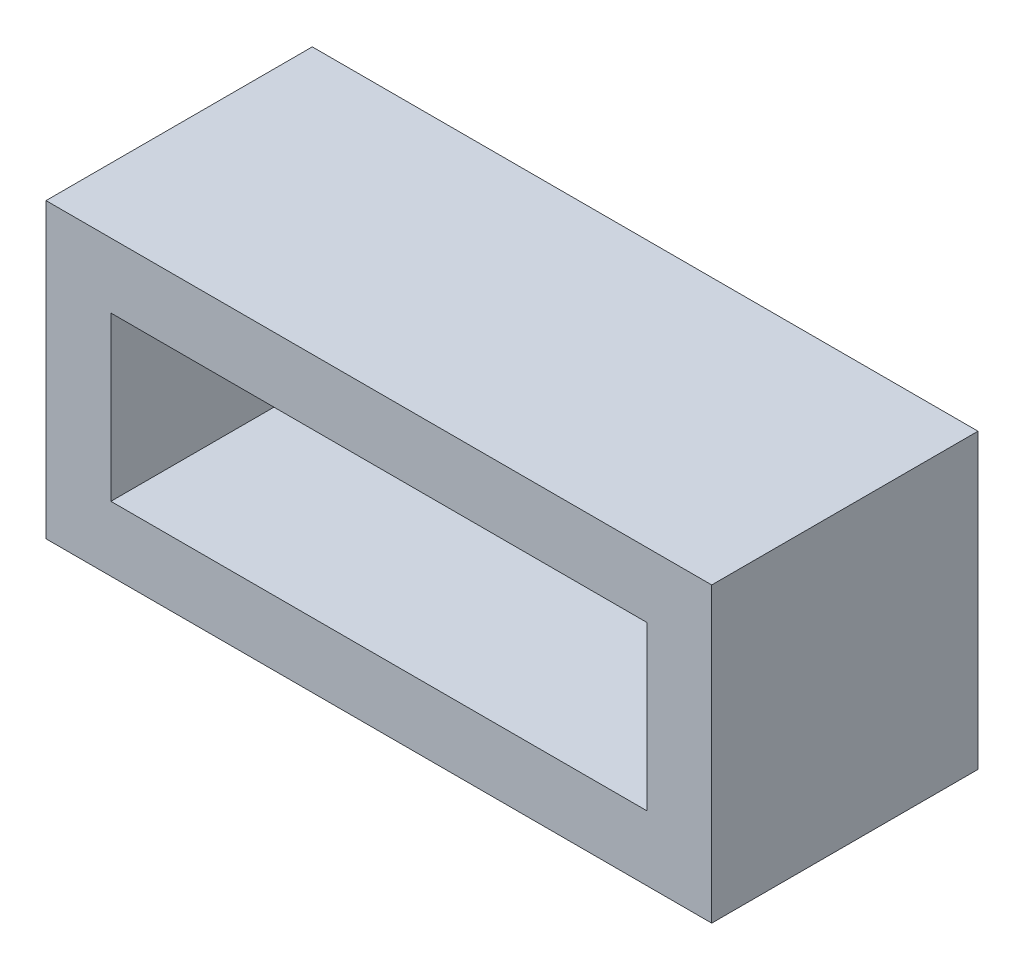
ISO-10303-21;
HEADER;
FILE_DESCRIPTION(('STEP AP214'),'2;1');
FILE_NAME('part.step','',(''),(''),'','','');
FILE_SCHEMA(('AUTOMOTIVE_DESIGN { 1 0 10303 214 1 1 1 1 }'));
ENDSEC;
DATA;
#1=APPLICATION_CONTEXT('core data for automotive mechanical design processes');
#2=APPLICATION_PROTOCOL_DEFINITION('international standard','automotive_design',2000,#1);
#3=PRODUCT_CONTEXT('',#1,'mechanical');
#4=PRODUCT('Part','Part','',(#3));
#5=PRODUCT_RELATED_PRODUCT_CATEGORY('part','',(#4));
#6=PRODUCT_DEFINITION_FORMATION('','',#4);
#7=PRODUCT_DEFINITION_CONTEXT('part definition',#1,'design');
#8=PRODUCT_DEFINITION('design','',#6,#7);
#9=PRODUCT_DEFINITION_SHAPE('','',#8);
#10=(LENGTH_UNIT() NAMED_UNIT(*) SI_UNIT(.MILLI.,.METRE.));
#11=(NAMED_UNIT(*) PLANE_ANGLE_UNIT() SI_UNIT($,.RADIAN.));
#12=(NAMED_UNIT(*) SI_UNIT($,.STERADIAN.) SOLID_ANGLE_UNIT());
#13=UNCERTAINTY_MEASURE_WITH_UNIT(LENGTH_MEASURE(1.E-05),#10,'distance_accuracy_value','');
#14=(GEOMETRIC_REPRESENTATION_CONTEXT(3) GLOBAL_UNCERTAINTY_ASSIGNED_CONTEXT((#13)) GLOBAL_UNIT_ASSIGNED_CONTEXT((#10,
#11,#12)) REPRESENTATION_CONTEXT('',''));
#15=CARTESIAN_POINT('',(0.,0.,0.));
#16=DIRECTION('',(0.,0.,1.));
#17=DIRECTION('',(1.,0.,0.));
#18=AXIS2_PLACEMENT_3D('',#15,#16,#17);
#19=CARTESIAN_POINT('',(0.,0.,10.));
#20=DIRECTION('',(0.,0.,-1.));
#21=DIRECTION('',(-1.,0.,0.));
#22=AXIS2_PLACEMENT_3D('',#19,#20,#21);
#23=PLANE('',#22);
#24=DIRECTION('',(0.,1.,0.));
#25=VECTOR('',#24,1.);
#26=CARTESIAN_POINT('',(12.5,-5.5,10.));
#27=LINE('',#26,#25);
#28=CARTESIAN_POINT('',(12.5,-5.5,10.));
#29=VERTEX_POINT('',#28);
#30=CARTESIAN_POINT('',(12.5,5.5,10.));
#31=VERTEX_POINT('',#30);
#32=EDGE_CURVE('E140',#29,#31,#27,.T.);
#33=ORIENTED_EDGE('',*,*,#32,.T.);
#34=DIRECTION('',(-1.,0.,0.));
#35=VECTOR('',#34,1.);
#36=CARTESIAN_POINT('',(-12.5,5.5,10.));
#37=LINE('',#36,#35);
#38=CARTESIAN_POINT('',(-12.5,5.5,10.));
#39=VERTEX_POINT('',#38);
#40=EDGE_CURVE('E143',#31,#39,#37,.T.);
#41=ORIENTED_EDGE('',*,*,#40,.T.);
#42=DIRECTION('',(0.,-1.,0.));
#43=VECTOR('',#42,1.);
#44=CARTESIAN_POINT('',(-12.5,-5.5,10.));
#45=LINE('',#44,#43);
#46=CARTESIAN_POINT('',(-12.5,-5.5,10.));
#47=VERTEX_POINT('',#46);
#48=EDGE_CURVE('E146',#39,#47,#45,.T.);
#49=ORIENTED_EDGE('',*,*,#48,.T.);
#50=DIRECTION('',(1.,0.,0.));
#51=VECTOR('',#50,1.);
#52=CARTESIAN_POINT('',(-12.5,-5.5,10.));
#53=LINE('',#52,#51);
#54=EDGE_CURVE('E148',#47,#29,#53,.T.);
#55=ORIENTED_EDGE('',*,*,#54,.T.);
#56=EDGE_LOOP('',(#33,#41,#49,#55));
#57=FACE_BOUND('',#56,.T.);
#58=DIRECTION('',(0.,1.,0.));
#59=VECTOR('',#58,1.);
#60=CARTESIAN_POINT('',(10.063,-3.0625,10.));
#61=LINE('',#60,#59);
#62=CARTESIAN_POINT('',(10.063,-3.0625,10.));
#63=VERTEX_POINT('',#62);
#64=CARTESIAN_POINT('',(10.063,3.0625,10.));
#65=VERTEX_POINT('',#64);
#66=EDGE_CURVE('E104',#63,#65,#61,.T.);
#67=ORIENTED_EDGE('',*,*,#66,.F.);
#68=DIRECTION('',(1.,0.,0.));
#69=VECTOR('',#68,1.);
#70=CARTESIAN_POINT('',(-10.063,-3.0625,10.));
#71=LINE('',#70,#69);
#72=CARTESIAN_POINT('',(-10.063,-3.0625,10.));
#73=VERTEX_POINT('',#72);
#74=EDGE_CURVE('E126',#73,#63,#71,.T.);
#75=ORIENTED_EDGE('',*,*,#74,.F.);
#76=DIRECTION('',(0.,-1.,0.));
#77=VECTOR('',#76,1.);
#78=CARTESIAN_POINT('',(-10.063,-3.0625,10.));
#79=LINE('',#78,#77);
#80=CARTESIAN_POINT('',(-10.063,3.0625,10.));
#81=VERTEX_POINT('',#80);
#82=EDGE_CURVE('E124',#81,#73,#79,.T.);
#83=ORIENTED_EDGE('',*,*,#82,.F.);
#84=DIRECTION('',(-1.,0.,0.));
#85=VECTOR('',#84,1.);
#86=CARTESIAN_POINT('',(-10.063,3.0625,10.));
#87=LINE('',#86,#85);
#88=EDGE_CURVE('E112',#65,#81,#87,.T.);
#89=ORIENTED_EDGE('',*,*,#88,.F.);
#90=EDGE_LOOP('',(#67,#75,#83,#89));
#91=FACE_BOUND('',#90,.T.);
#92=ADVANCED_FACE('F39',(#57,#91),#23,.F.);
#93=CARTESIAN_POINT('',(0.,0.,0.));
#94=DIRECTION('',(0.,0.,-1.));
#95=DIRECTION('',(-1.,0.,0.));
#96=AXIS2_PLACEMENT_3D('',#93,#94,#95);
#97=PLANE('',#96);
#98=DIRECTION('',(0.,1.,0.));
#99=VECTOR('',#98,1.);
#100=CARTESIAN_POINT('',(12.5,-5.5,0.));
#101=LINE('',#100,#99);
#102=CARTESIAN_POINT('',(12.5,-5.5,0.));
#103=VERTEX_POINT('',#102);
#104=CARTESIAN_POINT('',(12.5,5.5,0.));
#105=VERTEX_POINT('',#104);
#106=EDGE_CURVE('E120',#103,#105,#101,.T.);
#107=ORIENTED_EDGE('',*,*,#106,.F.);
#108=DIRECTION('',(1.,0.,0.));
#109=VECTOR('',#108,1.);
#110=CARTESIAN_POINT('',(-12.5,-5.5,0.));
#111=LINE('',#110,#109);
#112=CARTESIAN_POINT('',(-12.5,-5.5,0.));
#113=VERTEX_POINT('',#112);
#114=EDGE_CURVE('E144',#113,#103,#111,.T.);
#115=ORIENTED_EDGE('',*,*,#114,.F.);
#116=DIRECTION('',(0.,-1.,0.));
#117=VECTOR('',#116,1.);
#118=CARTESIAN_POINT('',(-12.5,-5.5,0.));
#119=LINE('',#118,#117);
#120=CARTESIAN_POINT('',(-12.5,5.5,0.));
#121=VERTEX_POINT('',#120);
#122=EDGE_CURVE('E155',#121,#113,#119,.T.);
#123=ORIENTED_EDGE('',*,*,#122,.F.);
#124=DIRECTION('',(-1.,0.,0.));
#125=VECTOR('',#124,1.);
#126=CARTESIAN_POINT('',(-12.5,5.5,0.));
#127=LINE('',#126,#125);
#128=EDGE_CURVE('E153',#105,#121,#127,.T.);
#129=ORIENTED_EDGE('',*,*,#128,.F.);
#130=EDGE_LOOP('',(#107,#115,#123,#129));
#131=FACE_BOUND('',#130,.T.);
#132=DIRECTION('',(1.,0.,0.));
#133=VECTOR('',#132,1.);
#134=CARTESIAN_POINT('',(-10.063,-3.0625,0.));
#135=LINE('',#134,#133);
#136=CARTESIAN_POINT('',(-10.063,-3.0625,0.));
#137=VERTEX_POINT('',#136);
#138=CARTESIAN_POINT('',(10.063,-3.0625,0.));
#139=VERTEX_POINT('',#138);
#140=EDGE_CURVE('E113',#137,#139,#135,.T.);
#141=ORIENTED_EDGE('',*,*,#140,.T.);
#142=DIRECTION('',(0.,1.,0.));
#143=VECTOR('',#142,1.);
#144=CARTESIAN_POINT('',(10.063,-3.0625,0.));
#145=LINE('',#144,#143);
#146=CARTESIAN_POINT('',(10.063,3.0625,0.));
#147=VERTEX_POINT('',#146);
#148=EDGE_CURVE('E62',#139,#147,#145,.T.);
#149=ORIENTED_EDGE('',*,*,#148,.T.);
#150=DIRECTION('',(-1.,0.,0.));
#151=VECTOR('',#150,1.);
#152=CARTESIAN_POINT('',(-10.063,3.0625,0.));
#153=LINE('',#152,#151);
#154=CARTESIAN_POINT('',(-10.063,3.0625,0.));
#155=VERTEX_POINT('',#154);
#156=EDGE_CURVE('E119',#147,#155,#153,.T.);
#157=ORIENTED_EDGE('',*,*,#156,.T.);
#158=DIRECTION('',(0.,-1.,0.));
#159=VECTOR('',#158,1.);
#160=CARTESIAN_POINT('',(-10.063,-3.0625,0.));
#161=LINE('',#160,#159);
#162=EDGE_CURVE('E132',#155,#137,#161,.T.);
#163=ORIENTED_EDGE('',*,*,#162,.T.);
#164=EDGE_LOOP('',(#141,#149,#157,#163));
#165=FACE_BOUND('',#164,.T.);
#166=ADVANCED_FACE('F173',(#131,#165),#97,.T.);
#167=CARTESIAN_POINT('',(12.5,-5.5,10.));
#168=DIRECTION('',(-1.,0.,0.));
#169=DIRECTION('',(0.,0.,1.));
#170=AXIS2_PLACEMENT_3D('',#167,#168,#169);
#171=PLANE('',#170);
#172=ORIENTED_EDGE('',*,*,#106,.T.);
#173=DIRECTION('',(0.,0.,-1.));
#174=VECTOR('',#173,1.);
#175=CARTESIAN_POINT('',(12.5,5.5,10.));
#176=LINE('',#175,#174);
#177=EDGE_CURVE('E11',#31,#105,#176,.T.);
#178=ORIENTED_EDGE('',*,*,#177,.F.);
#179=ORIENTED_EDGE('',*,*,#32,.F.);
#180=DIRECTION('',(0.,0.,-1.));
#181=VECTOR('',#180,1.);
#182=CARTESIAN_POINT('',(12.5,-5.5,10.));
#183=LINE('',#182,#181);
#184=EDGE_CURVE('E150',#29,#103,#183,.T.);
#185=ORIENTED_EDGE('',*,*,#184,.T.);
#186=EDGE_LOOP('',(#172,#178,#179,#185));
#187=FACE_BOUND('',#186,.T.);
#188=ADVANCED_FACE('F41',(#187),#171,.F.);
#189=CARTESIAN_POINT('',(-12.5,5.5,10.));
#190=DIRECTION('',(0.,-1.,0.));
#191=DIRECTION('',(0.,0.,-1.));
#192=AXIS2_PLACEMENT_3D('',#189,#190,#191);
#193=PLANE('',#192);
#194=ORIENTED_EDGE('',*,*,#128,.T.);
#195=DIRECTION('',(0.,0.,-1.));
#196=VECTOR('',#195,1.);
#197=CARTESIAN_POINT('',(-12.5,5.5,10.));
#198=LINE('',#197,#196);
#199=EDGE_CURVE('E47',#39,#121,#198,.T.);
#200=ORIENTED_EDGE('',*,*,#199,.F.);
#201=ORIENTED_EDGE('',*,*,#40,.F.);
#202=ORIENTED_EDGE('',*,*,#177,.T.);
#203=EDGE_LOOP('',(#194,#200,#201,#202));
#204=FACE_BOUND('',#203,.T.);
#205=ADVANCED_FACE('F183',(#204),#193,.F.);
#206=CARTESIAN_POINT('',(-12.5,-5.5,10.));
#207=DIRECTION('',(1.,0.,0.));
#208=DIRECTION('',(0.,0.,-1.));
#209=AXIS2_PLACEMENT_3D('',#206,#207,#208);
#210=PLANE('',#209);
#211=ORIENTED_EDGE('',*,*,#122,.T.);
#212=DIRECTION('',(0.,0.,-1.));
#213=VECTOR('',#212,1.);
#214=CARTESIAN_POINT('',(-12.5,-5.5,10.));
#215=LINE('',#214,#213);
#216=EDGE_CURVE('E160',#47,#113,#215,.T.);
#217=ORIENTED_EDGE('',*,*,#216,.F.);
#218=ORIENTED_EDGE('',*,*,#48,.F.);
#219=ORIENTED_EDGE('',*,*,#199,.T.);
#220=EDGE_LOOP('',(#211,#217,#218,#219));
#221=FACE_BOUND('',#220,.T.);
#222=ADVANCED_FACE('F167',(#221),#210,.F.);
#223=CARTESIAN_POINT('',(-12.5,-5.5,10.));
#224=DIRECTION('',(0.,1.,0.));
#225=DIRECTION('',(0.,0.,1.));
#226=AXIS2_PLACEMENT_3D('',#223,#224,#225);
#227=PLANE('',#226);
#228=ORIENTED_EDGE('',*,*,#114,.T.);
#229=ORIENTED_EDGE('',*,*,#184,.F.);
#230=ORIENTED_EDGE('',*,*,#54,.F.);
#231=ORIENTED_EDGE('',*,*,#216,.T.);
#232=EDGE_LOOP('',(#228,#229,#230,#231));
#233=FACE_BOUND('',#232,.T.);
#234=ADVANCED_FACE('F177',(#233),#227,.F.);
#235=CARTESIAN_POINT('',(10.063,-3.0625,10.));
#236=DIRECTION('',(-1.,0.,0.));
#237=DIRECTION('',(0.,0.,1.));
#238=AXIS2_PLACEMENT_3D('',#235,#236,#237);
#239=PLANE('',#238);
#240=ORIENTED_EDGE('',*,*,#148,.F.);
#241=DIRECTION('',(0.,0.,-1.));
#242=VECTOR('',#241,1.);
#243=CARTESIAN_POINT('',(10.063,-3.0625,10.));
#244=LINE('',#243,#242);
#245=EDGE_CURVE('E108',#63,#139,#244,.T.);
#246=ORIENTED_EDGE('',*,*,#245,.F.);
#247=ORIENTED_EDGE('',*,*,#66,.T.);
#248=DIRECTION('',(0.,0.,-1.));
#249=VECTOR('',#248,1.);
#250=CARTESIAN_POINT('',(10.063,3.0625,10.));
#251=LINE('',#250,#249);
#252=EDGE_CURVE('E107',#65,#147,#251,.T.);
#253=ORIENTED_EDGE('',*,*,#252,.T.);
#254=EDGE_LOOP('',(#240,#246,#247,#253));
#255=FACE_BOUND('',#254,.T.);
#256=ADVANCED_FACE('F106',(#255),#239,.T.);
#257=CARTESIAN_POINT('',(-10.063,3.0625,10.));
#258=DIRECTION('',(0.,-1.,0.));
#259=DIRECTION('',(0.,0.,-1.));
#260=AXIS2_PLACEMENT_3D('',#257,#258,#259);
#261=PLANE('',#260);
#262=ORIENTED_EDGE('',*,*,#156,.F.);
#263=ORIENTED_EDGE('',*,*,#252,.F.);
#264=ORIENTED_EDGE('',*,*,#88,.T.);
#265=DIRECTION('',(0.,0.,-1.));
#266=VECTOR('',#265,1.);
#267=CARTESIAN_POINT('',(-10.063,3.0625,10.));
#268=LINE('',#267,#266);
#269=EDGE_CURVE('E121',#81,#155,#268,.T.);
#270=ORIENTED_EDGE('',*,*,#269,.T.);
#271=EDGE_LOOP('',(#262,#263,#264,#270));
#272=FACE_BOUND('',#271,.T.);
#273=ADVANCED_FACE('F116',(#272),#261,.T.);
#274=CARTESIAN_POINT('',(-10.063,-3.0625,10.));
#275=DIRECTION('',(1.,0.,0.));
#276=DIRECTION('',(0.,0.,-1.));
#277=AXIS2_PLACEMENT_3D('',#274,#275,#276);
#278=PLANE('',#277);
#279=ORIENTED_EDGE('',*,*,#162,.F.);
#280=ORIENTED_EDGE('',*,*,#269,.F.);
#281=ORIENTED_EDGE('',*,*,#82,.T.);
#282=DIRECTION('',(0.,0.,-1.));
#283=VECTOR('',#282,1.);
#284=CARTESIAN_POINT('',(-10.063,-3.0625,10.));
#285=LINE('',#284,#283);
#286=EDGE_CURVE('E54',#73,#137,#285,.T.);
#287=ORIENTED_EDGE('',*,*,#286,.T.);
#288=EDGE_LOOP('',(#279,#280,#281,#287));
#289=FACE_BOUND('',#288,.T.);
#290=ADVANCED_FACE('F206',(#289),#278,.T.);
#291=CARTESIAN_POINT('',(-10.063,-3.0625,10.));
#292=DIRECTION('',(0.,1.,0.));
#293=DIRECTION('',(0.,0.,1.));
#294=AXIS2_PLACEMENT_3D('',#291,#292,#293);
#295=PLANE('',#294);
#296=ORIENTED_EDGE('',*,*,#140,.F.);
#297=ORIENTED_EDGE('',*,*,#286,.F.);
#298=ORIENTED_EDGE('',*,*,#74,.T.);
#299=ORIENTED_EDGE('',*,*,#245,.T.);
#300=EDGE_LOOP('',(#296,#297,#298,#299));
#301=FACE_BOUND('',#300,.T.);
#302=ADVANCED_FACE('F210',(#301),#295,.T.);
#303=CLOSED_SHELL('',(#92,#166,#188,#205,#222,#234,#256,#273,#290,#302));
#304=MANIFOLD_SOLID_BREP('B2',#303);
#305=ADVANCED_BREP_SHAPE_REPRESENTATION('',(#18,#304),#14);
#306=SHAPE_DEFINITION_REPRESENTATION(#9,#305);
ENDSEC;
END-ISO-10303-21;
